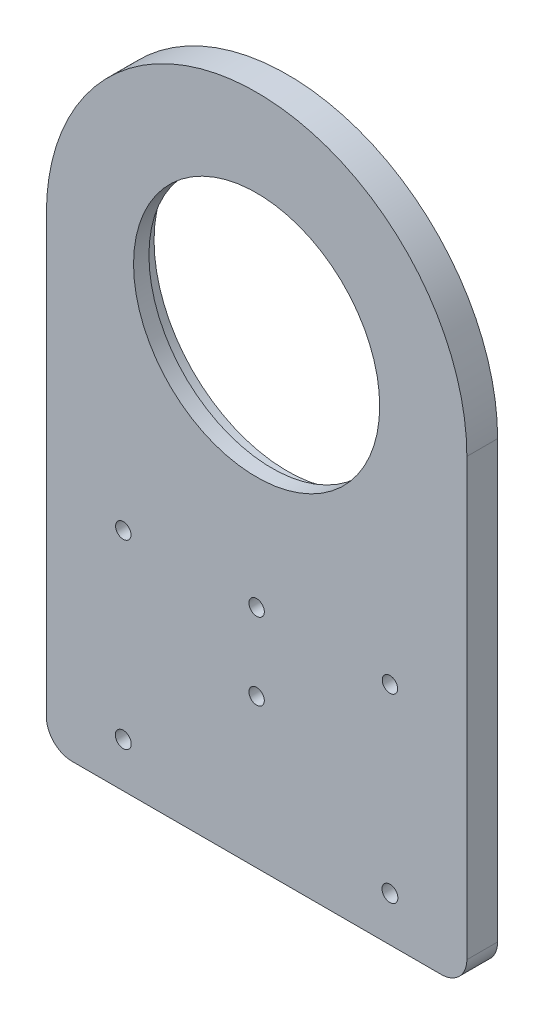
ISO-10303-21;
HEADER;
FILE_DESCRIPTION(('STEP AP214'),'2;1');
FILE_NAME('part.step','',(''),(''),'','','');
FILE_SCHEMA(('AUTOMOTIVE_DESIGN { 1 0 10303 214 1 1 1 1 }'));
ENDSEC;
DATA;
#1=APPLICATION_CONTEXT('core data for automotive mechanical design processes');
#2=APPLICATION_PROTOCOL_DEFINITION('international standard','automotive_design',2000,#1);
#3=PRODUCT_CONTEXT('',#1,'mechanical');
#4=PRODUCT('Part','Part','',(#3));
#5=PRODUCT_RELATED_PRODUCT_CATEGORY('part','',(#4));
#6=PRODUCT_DEFINITION_FORMATION('','',#4);
#7=PRODUCT_DEFINITION_CONTEXT('part definition',#1,'design');
#8=PRODUCT_DEFINITION('design','',#6,#7);
#9=PRODUCT_DEFINITION_SHAPE('','',#8);
#10=(LENGTH_UNIT() NAMED_UNIT(*) SI_UNIT(.MILLI.,.METRE.));
#11=(NAMED_UNIT(*) PLANE_ANGLE_UNIT() SI_UNIT($,.RADIAN.));
#12=(NAMED_UNIT(*) SI_UNIT($,.STERADIAN.) SOLID_ANGLE_UNIT());
#13=UNCERTAINTY_MEASURE_WITH_UNIT(LENGTH_MEASURE(1.E-05),#10,'distance_accuracy_value','');
#14=(GEOMETRIC_REPRESENTATION_CONTEXT(3) GLOBAL_UNCERTAINTY_ASSIGNED_CONTEXT((#13)) GLOBAL_UNIT_ASSIGNED_CONTEXT((#10,
#11,#12)) REPRESENTATION_CONTEXT('',''));
#15=CARTESIAN_POINT('',(0.,0.,0.));
#16=DIRECTION('',(0.,0.,1.));
#17=DIRECTION('',(1.,0.,0.));
#18=AXIS2_PLACEMENT_3D('',#15,#16,#17);
#19=CARTESIAN_POINT('',(38.1876354946597,0.,10.));
#20=DIRECTION('',(1.,0.,0.));
#21=DIRECTION('',(0.,1.,0.));
#22=AXIS2_PLACEMENT_3D('',#19,#20,#21);
#23=PLANE('',#22);
#24=DIRECTION('',(0.,1.,0.));
#25=VECTOR('',#24,1.);
#26=CARTESIAN_POINT('',(38.1876354946597,0.,4.));
#27=LINE('',#26,#25);
#28=CARTESIAN_POINT('',(38.1876354946597,-25.,4.));
#29=VERTEX_POINT('',#28);
#30=CARTESIAN_POINT('',(38.1876354946597,59.9978406675183,4.));
#31=VERTEX_POINT('',#30);
#32=EDGE_CURVE('E102',#29,#31,#27,.T.);
#33=ORIENTED_EDGE('',*,*,#32,.F.);
#34=DIRECTION('',(0.,0.,-1.));
#35=VECTOR('',#34,1.);
#36=CARTESIAN_POINT('',(38.1876354946597,-25.,10.));
#37=LINE('',#36,#35);
#38=CARTESIAN_POINT('',(38.1876354946597,-25.,10.));
#39=VERTEX_POINT('',#38);
#40=EDGE_CURVE('E63',#29,#39,#37,.F.);
#41=ORIENTED_EDGE('',*,*,#40,.T.);
#42=DIRECTION('',(0.,-1.,0.));
#43=VECTOR('',#42,1.);
#44=CARTESIAN_POINT('',(38.1876354946597,0.,10.));
#45=LINE('',#44,#43);
#46=CARTESIAN_POINT('',(38.1876354946597,59.9978406675183,10.));
#47=VERTEX_POINT('',#46);
#48=EDGE_CURVE('E146',#47,#39,#45,.T.);
#49=ORIENTED_EDGE('',*,*,#48,.F.);
#50=DIRECTION('',(0.,0.,-1.));
#51=VECTOR('',#50,1.);
#52=CARTESIAN_POINT('',(38.1876354946597,59.9978406675183,10.));
#53=LINE('',#52,#51);
#54=EDGE_CURVE('E120',#47,#31,#53,.T.);
#55=ORIENTED_EDGE('',*,*,#54,.T.);
#56=EDGE_LOOP('',(#33,#41,#49,#55));
#57=FACE_BOUND('',#56,.T.);
#58=ADVANCED_FACE('F40',(#57),#23,.F.);
#59=CARTESIAN_POINT('',(0.,-30.,10.));
#60=DIRECTION('',(0.,1.,0.));
#61=DIRECTION('',(-1.,0.,0.));
#62=AXIS2_PLACEMENT_3D('',#59,#60,#61);
#63=PLANE('',#62);
#64=DIRECTION('',(1.,0.,0.));
#65=VECTOR('',#64,1.);
#66=CARTESIAN_POINT('',(0.,-30.,10.));
#67=LINE('',#66,#65);
#68=CARTESIAN_POINT('',(43.1876354946597,-30.,10.));
#69=VERTEX_POINT('',#68);
#70=CARTESIAN_POINT('',(115.18763549466,-30.,10.));
#71=VERTEX_POINT('',#70);
#72=EDGE_CURVE('E145',#69,#71,#67,.T.);
#73=ORIENTED_EDGE('',*,*,#72,.F.);
#74=DIRECTION('',(0.,0.,-1.));
#75=VECTOR('',#74,1.);
#76=CARTESIAN_POINT('',(43.1876354946597,-30.,10.));
#77=LINE('',#76,#75);
#78=CARTESIAN_POINT('',(43.1876354946597,-30.,4.));
#79=VERTEX_POINT('',#78);
#80=EDGE_CURVE('E132',#69,#79,#77,.T.);
#81=ORIENTED_EDGE('',*,*,#80,.T.);
#82=DIRECTION('',(-1.,0.,0.));
#83=VECTOR('',#82,1.);
#84=CARTESIAN_POINT('',(0.,-30.,4.));
#85=LINE('',#84,#83);
#86=CARTESIAN_POINT('',(115.18763549466,-30.,4.));
#87=VERTEX_POINT('',#86);
#88=EDGE_CURVE('E112',#87,#79,#85,.T.);
#89=ORIENTED_EDGE('',*,*,#88,.F.);
#90=DIRECTION('',(0.,0.,1.));
#91=VECTOR('',#90,1.);
#92=CARTESIAN_POINT('',(115.18763549466,-30.,10.));
#93=LINE('',#92,#91);
#94=EDGE_CURVE('E129',#87,#71,#93,.T.);
#95=ORIENTED_EDGE('',*,*,#94,.T.);
#96=EDGE_LOOP('',(#73,#81,#89,#95));
#97=FACE_BOUND('',#96,.T.);
#98=ADVANCED_FACE('F150',(#97),#63,.F.);
#99=CARTESIAN_POINT('',(120.18763549466,0.,10.));
#100=DIRECTION('',(1.,0.,0.));
#101=DIRECTION('',(0.,0.,-1.));
#102=AXIS2_PLACEMENT_3D('',#99,#100,#101);
#103=PLANE('',#102);
#104=DIRECTION('',(0.,-1.,0.));
#105=VECTOR('',#104,1.);
#106=CARTESIAN_POINT('',(120.18763549466,0.,10.));
#107=LINE('',#106,#105);
#108=CARTESIAN_POINT('',(120.18763549466,59.9978406675183,10.));
#109=VERTEX_POINT('',#108);
#110=CARTESIAN_POINT('',(120.18763549466,-25.,10.));
#111=VERTEX_POINT('',#110);
#112=EDGE_CURVE('E125',#109,#111,#107,.T.);
#113=ORIENTED_EDGE('',*,*,#112,.T.);
#114=DIRECTION('',(0.,0.,1.));
#115=VECTOR('',#114,1.);
#116=CARTESIAN_POINT('',(120.18763549466,-25.,4.));
#117=LINE('',#116,#115);
#118=CARTESIAN_POINT('',(120.18763549466,-25.,4.));
#119=VERTEX_POINT('',#118);
#120=EDGE_CURVE('E11',#111,#119,#117,.F.);
#121=ORIENTED_EDGE('',*,*,#120,.T.);
#122=DIRECTION('',(0.,-1.,0.));
#123=VECTOR('',#122,1.);
#124=CARTESIAN_POINT('',(120.18763549466,0.,4.));
#125=LINE('',#124,#123);
#126=CARTESIAN_POINT('',(120.18763549466,59.9978406675183,4.));
#127=VERTEX_POINT('',#126);
#128=EDGE_CURVE('E100',#127,#119,#125,.T.);
#129=ORIENTED_EDGE('',*,*,#128,.F.);
#130=DIRECTION('',(0.,0.,-1.));
#131=VECTOR('',#130,1.);
#132=CARTESIAN_POINT('',(120.18763549466,59.9978406675183,10.));
#133=LINE('',#132,#131);
#134=EDGE_CURVE('E110',#109,#127,#133,.T.);
#135=ORIENTED_EDGE('',*,*,#134,.F.);
#136=EDGE_LOOP('',(#113,#121,#129,#135));
#137=FACE_BOUND('',#136,.T.);
#138=ADVANCED_FACE('F109',(#137),#103,.T.);
#139=CARTESIAN_POINT('',(79.1876354946597,59.9978406675183,10.));
#140=DIRECTION('',(0.,0.,-1.));
#141=DIRECTION('',(-1.,0.,0.));
#142=AXIS2_PLACEMENT_3D('',#139,#140,#141);
#143=CYLINDRICAL_SURFACE('',#142,41.);
#144=CARTESIAN_POINT('',(79.1876354946597,59.9978406675183,4.));
#145=DIRECTION('',(0.,0.,-1.));
#146=DIRECTION('',(-1.,0.,0.));
#147=AXIS2_PLACEMENT_3D('',#144,#145,#146);
#148=CIRCLE('',#147,41.);
#149=EDGE_CURVE('E95',#31,#127,#148,.T.);
#150=ORIENTED_EDGE('',*,*,#149,.F.);
#151=ORIENTED_EDGE('',*,*,#54,.F.);
#152=CARTESIAN_POINT('',(79.1876354946597,59.9978406675183,10.));
#153=DIRECTION('',(0.,0.,1.));
#154=DIRECTION('',(1.,0.,0.));
#155=AXIS2_PLACEMENT_3D('',#152,#153,#154);
#156=CIRCLE('',#155,41.);
#157=EDGE_CURVE('E118',#109,#47,#156,.T.);
#158=ORIENTED_EDGE('',*,*,#157,.F.);
#159=ORIENTED_EDGE('',*,*,#134,.T.);
#160=EDGE_LOOP('',(#150,#151,#158,#159));
#161=FACE_BOUND('',#160,.T.);
#162=ADVANCED_FACE('F116',(#161),#143,.T.);
#163=CARTESIAN_POINT('',(79.1876354946597,59.9978406675183,10.));
#164=DIRECTION('',(0.,0.,-1.));
#165=DIRECTION('',(-1.,0.,0.));
#166=AXIS2_PLACEMENT_3D('',#163,#164,#165);
#167=CYLINDRICAL_SURFACE('',#166,26.);
#168=CARTESIAN_POINT('',(79.1876354946597,59.9978406675183,7.));
#169=DIRECTION('',(0.,0.,1.));
#170=DIRECTION('',(1.,0.,0.));
#171=AXIS2_PLACEMENT_3D('',#168,#169,#170);
#172=CIRCLE('',#171,26.);
#173=CARTESIAN_POINT('',(105.18763549466,59.9978406675183,7.));
#174=VERTEX_POINT('',#173);
#175=EDGE_CURVE('E119',#174,#174,#172,.T.);
#176=ORIENTED_EDGE('',*,*,#175,.T.);
#177=EDGE_LOOP('',(#176));
#178=FACE_BOUND('',#177,.T.);
#179=CARTESIAN_POINT('',(79.1876354946597,59.9978406675183,4.));
#180=DIRECTION('',(0.,0.,-1.));
#181=DIRECTION('',(-1.,0.,0.));
#182=AXIS2_PLACEMENT_3D('',#179,#180,#181);
#183=CIRCLE('',#182,26.);
#184=CARTESIAN_POINT('',(53.1876354946597,59.9978406675183,4.));
#185=VERTEX_POINT('',#184);
#186=EDGE_CURVE('E106',#185,#185,#183,.F.);
#187=ORIENTED_EDGE('',*,*,#186,.F.);
#188=EDGE_LOOP('',(#187));
#189=FACE_BOUND('',#188,.T.);
#190=ADVANCED_FACE('F182',(#178,#189),#167,.F.);
#191=CARTESIAN_POINT('',(120.18763549466,101.007840667518,10.));
#192=DIRECTION('',(0.,0.,1.));
#193=DIRECTION('',(1.,0.,0.));
#194=AXIS2_PLACEMENT_3D('',#191,#192,#193);
#195=PLANE('',#194);
#196=CARTESIAN_POINT('',(53.1876354946597,-21.3,10.));
#197=DIRECTION('',(0.,0.,1.));
#198=DIRECTION('',(1.,0.,0.));
#199=AXIS2_PLACEMENT_3D('',#196,#197,#198);
#200=CIRCLE('',#199,1.55);
#201=CARTESIAN_POINT('',(54.7376354946597,-21.3,10.));
#202=VERTEX_POINT('',#201);
#203=EDGE_CURVE('E245',#202,#202,#200,.T.);
#204=ORIENTED_EDGE('',*,*,#203,.F.);
#205=EDGE_LOOP('',(#204));
#206=FACE_BOUND('',#205,.T.);
#207=CARTESIAN_POINT('',(105.18763549466,-21.3,10.));
#208=DIRECTION('',(0.,0.,1.));
#209=DIRECTION('',(1.,0.,0.));
#210=AXIS2_PLACEMENT_3D('',#207,#208,#209);
#211=CIRCLE('',#210,1.54999999999999);
#212=CARTESIAN_POINT('',(106.73763549466,-21.3,10.));
#213=VERTEX_POINT('',#212);
#214=EDGE_CURVE('E248',#213,#213,#211,.T.);
#215=ORIENTED_EDGE('',*,*,#214,.F.);
#216=EDGE_LOOP('',(#215));
#217=FACE_BOUND('',#216,.T.);
#218=CARTESIAN_POINT('',(79.1876354946597,13.9978406675183,10.));
#219=DIRECTION('',(0.,0.,1.));
#220=DIRECTION('',(1.,0.,0.));
#221=AXIS2_PLACEMENT_3D('',#218,#219,#220);
#222=CIRCLE('',#221,1.5);
#223=CARTESIAN_POINT('',(80.6876354946597,13.9978406675183,10.));
#224=VERTEX_POINT('',#223);
#225=EDGE_CURVE('E260',#224,#224,#222,.T.);
#226=ORIENTED_EDGE('',*,*,#225,.F.);
#227=EDGE_LOOP('',(#226));
#228=FACE_BOUND('',#227,.T.);
#229=CARTESIAN_POINT('',(79.1876354946597,-1.00215933248166,10.));
#230=DIRECTION('',(0.,0.,-1.));
#231=DIRECTION('',(-1.,0.,0.));
#232=AXIS2_PLACEMENT_3D('',#229,#230,#231);
#233=CIRCLE('',#232,1.5);
#234=CARTESIAN_POINT('',(77.6876354946597,-1.00215933248166,10.));
#235=VERTEX_POINT('',#234);
#236=EDGE_CURVE('E275',#235,#235,#233,.T.);
#237=ORIENTED_EDGE('',*,*,#236,.T.);
#238=EDGE_LOOP('',(#237));
#239=FACE_BOUND('',#238,.T.);
#240=CARTESIAN_POINT('',(53.1876354946597,13.9978406675183,10.));
#241=DIRECTION('',(0.,0.,-1.));
#242=DIRECTION('',(-1.,0.,0.));
#243=AXIS2_PLACEMENT_3D('',#240,#241,#242);
#244=CIRCLE('',#243,1.5);
#245=CARTESIAN_POINT('',(51.6876354946597,13.9978406675183,10.));
#246=VERTEX_POINT('',#245);
#247=EDGE_CURVE('E269',#246,#246,#244,.T.);
#248=ORIENTED_EDGE('',*,*,#247,.T.);
#249=EDGE_LOOP('',(#248));
#250=FACE_BOUND('',#249,.T.);
#251=CARTESIAN_POINT('',(105.18763549466,13.9978406675183,10.));
#252=DIRECTION('',(0.,0.,-1.));
#253=DIRECTION('',(-1.,0.,0.));
#254=AXIS2_PLACEMENT_3D('',#251,#252,#253);
#255=CIRCLE('',#254,1.5);
#256=CARTESIAN_POINT('',(103.68763549466,13.9978406675183,10.));
#257=VERTEX_POINT('',#256);
#258=EDGE_CURVE('E113',#257,#257,#255,.T.);
#259=ORIENTED_EDGE('',*,*,#258,.T.);
#260=EDGE_LOOP('',(#259));
#261=FACE_BOUND('',#260,.T.);
#262=ORIENTED_EDGE('',*,*,#48,.T.);
#263=CARTESIAN_POINT('',(43.1876354946597,-25.,10.));
#264=DIRECTION('',(0.,0.,1.));
#265=DIRECTION('',(1.,0.,0.));
#266=AXIS2_PLACEMENT_3D('',#263,#264,#265);
#267=CIRCLE('',#266,5.);
#268=EDGE_CURVE('E48',#39,#69,#267,.T.);
#269=ORIENTED_EDGE('',*,*,#268,.T.);
#270=ORIENTED_EDGE('',*,*,#72,.T.);
#271=CARTESIAN_POINT('',(115.18763549466,-25.,10.));
#272=DIRECTION('',(0.,0.,1.));
#273=DIRECTION('',(1.,0.,0.));
#274=AXIS2_PLACEMENT_3D('',#271,#272,#273);
#275=CIRCLE('',#274,5.);
#276=EDGE_CURVE('E55',#71,#111,#275,.T.);
#277=ORIENTED_EDGE('',*,*,#276,.T.);
#278=ORIENTED_EDGE('',*,*,#112,.F.);
#279=ORIENTED_EDGE('',*,*,#157,.T.);
#280=EDGE_LOOP('',(#262,#269,#270,#277,#278,#279));
#281=FACE_BOUND('',#280,.T.);
#282=CARTESIAN_POINT('',(79.1876354946597,59.9978406675183,10.));
#283=DIRECTION('',(0.,0.,1.));
#284=DIRECTION('',(1.,0.,0.));
#285=AXIS2_PLACEMENT_3D('',#282,#283,#284);
#286=CIRCLE('',#285,24.);
#287=CARTESIAN_POINT('',(103.18763549466,59.9978406675183,10.));
#288=VERTEX_POINT('',#287);
#289=EDGE_CURVE('E133',#288,#288,#286,.T.);
#290=ORIENTED_EDGE('',*,*,#289,.F.);
#291=EDGE_LOOP('',(#290));
#292=FACE_BOUND('',#291,.T.);
#293=ADVANCED_FACE('F143',(#206,#217,#228,#239,#250,#261,#281,#292),#195,.T.);
#294=CARTESIAN_POINT('',(79.1876354946597,59.9978406675183,7.));
#295=DIRECTION('',(0.,0.,1.));
#296=DIRECTION('',(1.,0.,0.));
#297=AXIS2_PLACEMENT_3D('',#294,#295,#296);
#298=PLANE('',#297);
#299=CARTESIAN_POINT('',(79.1876354946597,59.9978406675183,7.));
#300=DIRECTION('',(0.,0.,1.));
#301=DIRECTION('',(1.,0.,0.));
#302=AXIS2_PLACEMENT_3D('',#299,#300,#301);
#303=CIRCLE('',#302,24.);
#304=CARTESIAN_POINT('',(103.18763549466,59.9978406675183,7.));
#305=VERTEX_POINT('',#304);
#306=EDGE_CURVE('E123',#305,#305,#303,.T.);
#307=ORIENTED_EDGE('',*,*,#306,.T.);
#308=EDGE_LOOP('',(#307));
#309=FACE_BOUND('',#308,.T.);
#310=ORIENTED_EDGE('',*,*,#175,.F.);
#311=EDGE_LOOP('',(#310));
#312=FACE_BOUND('',#311,.T.);
#313=ADVANCED_FACE('F188',(#309,#312),#298,.F.);
#314=CARTESIAN_POINT('',(79.1876354946597,59.9978406675183,7.));
#315=DIRECTION('',(0.,0.,1.));
#316=DIRECTION('',(1.,0.,0.));
#317=AXIS2_PLACEMENT_3D('',#314,#315,#316);
#318=CYLINDRICAL_SURFACE('',#317,24.);
#319=ORIENTED_EDGE('',*,*,#306,.F.);
#320=EDGE_LOOP('',(#319));
#321=FACE_BOUND('',#320,.T.);
#322=ORIENTED_EDGE('',*,*,#289,.T.);
#323=EDGE_LOOP('',(#322));
#324=FACE_BOUND('',#323,.T.);
#325=ADVANCED_FACE('F193',(#321,#324),#318,.F.);
#326=CARTESIAN_POINT('',(0.,0.,4.));
#327=DIRECTION('',(0.,0.,-1.));
#328=DIRECTION('',(-1.,0.,0.));
#329=AXIS2_PLACEMENT_3D('',#326,#327,#328);
#330=PLANE('',#329);
#331=CARTESIAN_POINT('',(53.1876354946597,-21.3,4.));
#332=DIRECTION('',(0.,0.,-1.));
#333=DIRECTION('',(-1.,0.,0.));
#334=AXIS2_PLACEMENT_3D('',#331,#332,#333);
#335=CIRCLE('',#334,1.55);
#336=CARTESIAN_POINT('',(51.6376354946597,-21.3,4.));
#337=VERTEX_POINT('',#336);
#338=EDGE_CURVE('E247',#337,#337,#335,.T.);
#339=ORIENTED_EDGE('',*,*,#338,.F.);
#340=EDGE_LOOP('',(#339));
#341=FACE_BOUND('',#340,.T.);
#342=CARTESIAN_POINT('',(105.18763549466,-21.3,4.));
#343=DIRECTION('',(0.,0.,-1.));
#344=DIRECTION('',(-1.,0.,0.));
#345=AXIS2_PLACEMENT_3D('',#342,#343,#344);
#346=CIRCLE('',#345,1.54999999999999);
#347=CARTESIAN_POINT('',(103.63763549466,-21.3,4.));
#348=VERTEX_POINT('',#347);
#349=EDGE_CURVE('E249',#348,#348,#346,.T.);
#350=ORIENTED_EDGE('',*,*,#349,.F.);
#351=EDGE_LOOP('',(#350));
#352=FACE_BOUND('',#351,.T.);
#353=CARTESIAN_POINT('',(79.1876354946597,13.9978406675183,4.));
#354=DIRECTION('',(0.,0.,-1.));
#355=DIRECTION('',(-1.,0.,0.));
#356=AXIS2_PLACEMENT_3D('',#353,#354,#355);
#357=CIRCLE('',#356,1.5);
#358=CARTESIAN_POINT('',(77.6876354946597,13.9978406675183,4.));
#359=VERTEX_POINT('',#358);
#360=EDGE_CURVE('E257',#359,#359,#357,.T.);
#361=ORIENTED_EDGE('',*,*,#360,.F.);
#362=EDGE_LOOP('',(#361));
#363=FACE_BOUND('',#362,.T.);
#364=CARTESIAN_POINT('',(79.1876354946597,-1.00215933248166,4.));
#365=DIRECTION('',(0.,0.,-1.));
#366=DIRECTION('',(-1.,0.,0.));
#367=AXIS2_PLACEMENT_3D('',#364,#365,#366);
#368=CIRCLE('',#367,1.5);
#369=CARTESIAN_POINT('',(77.6876354946597,-1.00215933248166,4.));
#370=VERTEX_POINT('',#369);
#371=EDGE_CURVE('E263',#370,#370,#368,.T.);
#372=ORIENTED_EDGE('',*,*,#371,.F.);
#373=EDGE_LOOP('',(#372));
#374=FACE_BOUND('',#373,.T.);
#375=CARTESIAN_POINT('',(53.1876354946597,13.9978406675183,4.));
#376=DIRECTION('',(0.,0.,-1.));
#377=DIRECTION('',(-1.,0.,0.));
#378=AXIS2_PLACEMENT_3D('',#375,#376,#377);
#379=CIRCLE('',#378,1.5);
#380=CARTESIAN_POINT('',(51.6876354946597,13.9978406675183,4.));
#381=VERTEX_POINT('',#380);
#382=EDGE_CURVE('E272',#381,#381,#379,.T.);
#383=ORIENTED_EDGE('',*,*,#382,.F.);
#384=EDGE_LOOP('',(#383));
#385=FACE_BOUND('',#384,.T.);
#386=CARTESIAN_POINT('',(105.18763549466,13.9978406675183,4.));
#387=DIRECTION('',(0.,0.,-1.));
#388=DIRECTION('',(-1.,0.,0.));
#389=AXIS2_PLACEMENT_3D('',#386,#387,#388);
#390=CIRCLE('',#389,1.5);
#391=CARTESIAN_POINT('',(103.68763549466,13.9978406675183,4.));
#392=VERTEX_POINT('',#391);
#393=EDGE_CURVE('E266',#392,#392,#390,.T.);
#394=ORIENTED_EDGE('',*,*,#393,.F.);
#395=EDGE_LOOP('',(#394));
#396=FACE_BOUND('',#395,.T.);
#397=ORIENTED_EDGE('',*,*,#88,.T.);
#398=CARTESIAN_POINT('',(43.1876354946597,-25.,4.));
#399=DIRECTION('',(0.,0.,-1.));
#400=DIRECTION('',(-1.,0.,0.));
#401=AXIS2_PLACEMENT_3D('',#398,#399,#400);
#402=CIRCLE('',#401,5.);
#403=EDGE_CURVE('E138',#79,#29,#402,.T.);
#404=ORIENTED_EDGE('',*,*,#403,.T.);
#405=ORIENTED_EDGE('',*,*,#32,.T.);
#406=ORIENTED_EDGE('',*,*,#149,.T.);
#407=ORIENTED_EDGE('',*,*,#128,.T.);
#408=CARTESIAN_POINT('',(115.18763549466,-25.,4.));
#409=DIRECTION('',(0.,0.,-1.));
#410=DIRECTION('',(-1.,0.,0.));
#411=AXIS2_PLACEMENT_3D('',#408,#409,#410);
#412=CIRCLE('',#411,5.);
#413=EDGE_CURVE('E136',#119,#87,#412,.T.);
#414=ORIENTED_EDGE('',*,*,#413,.T.);
#415=EDGE_LOOP('',(#397,#404,#405,#406,#407,#414));
#416=FACE_BOUND('',#415,.T.);
#417=ORIENTED_EDGE('',*,*,#186,.T.);
#418=EDGE_LOOP('',(#417));
#419=FACE_BOUND('',#418,.T.);
#420=ADVANCED_FACE('F98',(#341,#352,#363,#374,#385,#396,#416,#419),#330,.T.);
#421=CARTESIAN_POINT('',(105.18763549466,13.9978406675183,10.));
#422=DIRECTION('',(0.,0.,-1.));
#423=DIRECTION('',(-1.,0.,0.));
#424=AXIS2_PLACEMENT_3D('',#421,#422,#423);
#425=CYLINDRICAL_SURFACE('',#424,1.5);
#426=ORIENTED_EDGE('',*,*,#258,.F.);
#427=EDGE_LOOP('',(#426));
#428=FACE_BOUND('',#427,.T.);
#429=ORIENTED_EDGE('',*,*,#393,.T.);
#430=EDGE_LOOP('',(#429));
#431=FACE_BOUND('',#430,.T.);
#432=ADVANCED_FACE('F212',(#428,#431),#425,.F.);
#433=CARTESIAN_POINT('',(53.1876354946597,13.9978406675183,10.));
#434=DIRECTION('',(0.,0.,-1.));
#435=DIRECTION('',(-1.,0.,0.));
#436=AXIS2_PLACEMENT_3D('',#433,#434,#435);
#437=CYLINDRICAL_SURFACE('',#436,1.5);
#438=ORIENTED_EDGE('',*,*,#247,.F.);
#439=EDGE_LOOP('',(#438));
#440=FACE_BOUND('',#439,.T.);
#441=ORIENTED_EDGE('',*,*,#382,.T.);
#442=EDGE_LOOP('',(#441));
#443=FACE_BOUND('',#442,.T.);
#444=ADVANCED_FACE('F217',(#440,#443),#437,.F.);
#445=CARTESIAN_POINT('',(79.1876354946597,-1.00215933248166,10.));
#446=DIRECTION('',(0.,0.,-1.));
#447=DIRECTION('',(-1.,0.,0.));
#448=AXIS2_PLACEMENT_3D('',#445,#446,#447);
#449=CYLINDRICAL_SURFACE('',#448,1.5);
#450=ORIENTED_EDGE('',*,*,#236,.F.);
#451=EDGE_LOOP('',(#450));
#452=FACE_BOUND('',#451,.T.);
#453=ORIENTED_EDGE('',*,*,#371,.T.);
#454=EDGE_LOOP('',(#453));
#455=FACE_BOUND('',#454,.T.);
#456=ADVANCED_FACE('F223',(#452,#455),#449,.F.);
#457=CARTESIAN_POINT('',(79.1876354946597,13.9978406675183,14.));
#458=DIRECTION('',(0.,0.,-1.));
#459=DIRECTION('',(-1.,0.,0.));
#460=AXIS2_PLACEMENT_3D('',#457,#458,#459);
#461=CYLINDRICAL_SURFACE('',#460,1.5);
#462=ORIENTED_EDGE('',*,*,#225,.T.);
#463=EDGE_LOOP('',(#462));
#464=FACE_BOUND('',#463,.T.);
#465=ORIENTED_EDGE('',*,*,#360,.T.);
#466=EDGE_LOOP('',(#465));
#467=FACE_BOUND('',#466,.T.);
#468=ADVANCED_FACE('F226',(#464,#467),#461,.F.);
#469=CARTESIAN_POINT('',(105.18763549466,-21.3,14.));
#470=DIRECTION('',(0.,0.,-1.));
#471=DIRECTION('',(-1.,0.,0.));
#472=AXIS2_PLACEMENT_3D('',#469,#470,#471);
#473=CYLINDRICAL_SURFACE('',#472,1.54999999999999);
#474=ORIENTED_EDGE('',*,*,#214,.T.);
#475=EDGE_LOOP('',(#474));
#476=FACE_BOUND('',#475,.T.);
#477=ORIENTED_EDGE('',*,*,#349,.T.);
#478=EDGE_LOOP('',(#477));
#479=FACE_BOUND('',#478,.T.);
#480=ADVANCED_FACE('F233',(#476,#479),#473,.F.);
#481=CARTESIAN_POINT('',(53.1876354946597,-21.3,14.));
#482=DIRECTION('',(0.,0.,-1.));
#483=DIRECTION('',(-1.,0.,0.));
#484=AXIS2_PLACEMENT_3D('',#481,#482,#483);
#485=CYLINDRICAL_SURFACE('',#484,1.55);
#486=ORIENTED_EDGE('',*,*,#203,.T.);
#487=EDGE_LOOP('',(#486));
#488=FACE_BOUND('',#487,.T.);
#489=ORIENTED_EDGE('',*,*,#338,.T.);
#490=EDGE_LOOP('',(#489));
#491=FACE_BOUND('',#490,.T.);
#492=ADVANCED_FACE('F170',(#488,#491),#485,.F.);
#493=CARTESIAN_POINT('',(43.1876354946597,-25.,10.));
#494=DIRECTION('',(0.,0.,-1.));
#495=DIRECTION('',(-1.,0.,0.));
#496=AXIS2_PLACEMENT_3D('',#493,#494,#495);
#497=CYLINDRICAL_SURFACE('',#496,5.);
#498=ORIENTED_EDGE('',*,*,#268,.F.);
#499=ORIENTED_EDGE('',*,*,#40,.F.);
#500=ORIENTED_EDGE('',*,*,#403,.F.);
#501=ORIENTED_EDGE('',*,*,#80,.F.);
#502=EDGE_LOOP('',(#498,#499,#500,#501));
#503=FACE_BOUND('',#502,.T.);
#504=ADVANCED_FACE('F154',(#503),#497,.T.);
#505=CARTESIAN_POINT('',(115.18763549466,-25.,10.));
#506=DIRECTION('',(0.,0.,-1.));
#507=DIRECTION('',(-1.,0.,0.));
#508=AXIS2_PLACEMENT_3D('',#505,#506,#507);
#509=CYLINDRICAL_SURFACE('',#508,5.);
#510=ORIENTED_EDGE('',*,*,#413,.F.);
#511=ORIENTED_EDGE('',*,*,#120,.F.);
#512=ORIENTED_EDGE('',*,*,#276,.F.);
#513=ORIENTED_EDGE('',*,*,#94,.F.);
#514=EDGE_LOOP('',(#510,#511,#512,#513));
#515=FACE_BOUND('',#514,.T.);
#516=ADVANCED_FACE('F42',(#515),#509,.T.);
#517=CLOSED_SHELL('',(#58,#98,#138,#162,#190,#293,#313,#325,#420,#432,#444,#456,#468,#480,#492,
#504,#516));
#518=MANIFOLD_SOLID_BREP('B2',#517);
#519=ADVANCED_BREP_SHAPE_REPRESENTATION('',(#18,#518),#14);
#520=SHAPE_DEFINITION_REPRESENTATION(#9,#519);
ENDSEC;
END-ISO-10303-21;
